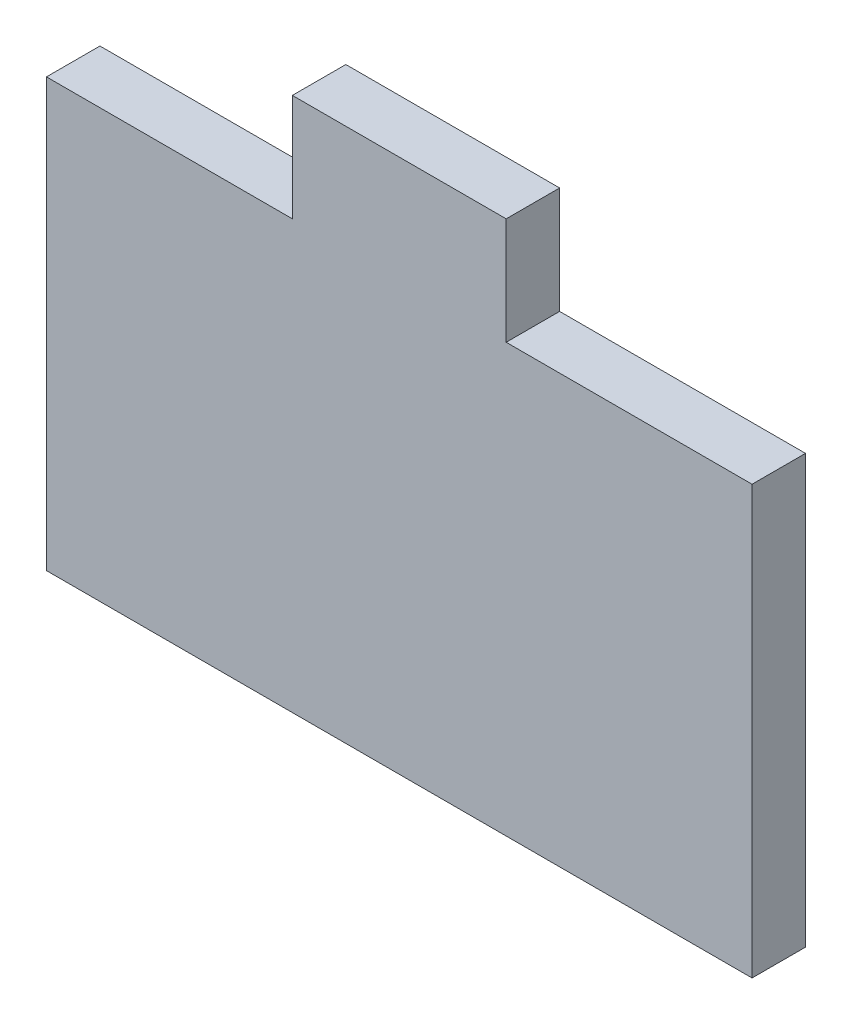
ISO-10303-21;
HEADER;
FILE_DESCRIPTION(('STEP AP214'),'2;1');
FILE_NAME('part.step','',(''),(''),'','','');
FILE_SCHEMA(('AUTOMOTIVE_DESIGN { 1 0 10303 214 1 1 1 1 }'));
ENDSEC;
DATA;
#1=APPLICATION_CONTEXT('core data for automotive mechanical design processes');
#2=APPLICATION_PROTOCOL_DEFINITION('international standard','automotive_design',2000,#1);
#3=PRODUCT_CONTEXT('',#1,'mechanical');
#4=PRODUCT('Part','Part','',(#3));
#5=PRODUCT_RELATED_PRODUCT_CATEGORY('part','',(#4));
#6=PRODUCT_DEFINITION_FORMATION('','',#4);
#7=PRODUCT_DEFINITION_CONTEXT('part definition',#1,'design');
#8=PRODUCT_DEFINITION('design','',#6,#7);
#9=PRODUCT_DEFINITION_SHAPE('','',#8);
#10=(LENGTH_UNIT() NAMED_UNIT(*) SI_UNIT(.MILLI.,.METRE.));
#11=(NAMED_UNIT(*) PLANE_ANGLE_UNIT() SI_UNIT($,.RADIAN.));
#12=(NAMED_UNIT(*) SI_UNIT($,.STERADIAN.) SOLID_ANGLE_UNIT());
#13=UNCERTAINTY_MEASURE_WITH_UNIT(LENGTH_MEASURE(1.E-05),#10,'distance_accuracy_value','');
#14=(GEOMETRIC_REPRESENTATION_CONTEXT(3) GLOBAL_UNCERTAINTY_ASSIGNED_CONTEXT((#13)) GLOBAL_UNIT_ASSIGNED_CONTEXT((#10,
#11,#12)) REPRESENTATION_CONTEXT('',''));
#15=CARTESIAN_POINT('',(0.,0.,0.));
#16=DIRECTION('',(0.,0.,1.));
#17=DIRECTION('',(1.,0.,0.));
#18=AXIS2_PLACEMENT_3D('',#15,#16,#17);
#19=CARTESIAN_POINT('',(0.,15.,2.5));
#20=DIRECTION('',(0.,-1.,0.));
#21=DIRECTION('',(1.,0.,0.));
#22=AXIS2_PLACEMENT_3D('',#19,#20,#21);
#23=PLANE('',#22);
#24=DIRECTION('',(-1.,0.,0.));
#25=VECTOR('',#24,1.);
#26=CARTESIAN_POINT('',(0.,15.,0.));
#27=LINE('',#26,#25);
#28=CARTESIAN_POINT('',(5.,15.,0.));
#29=VERTEX_POINT('',#28);
#30=CARTESIAN_POINT('',(-5.,15.,0.));
#31=VERTEX_POINT('',#30);
#32=EDGE_CURVE('E148',#29,#31,#27,.T.);
#33=ORIENTED_EDGE('',*,*,#32,.T.);
#34=DIRECTION('',(0.,0.,-1.));
#35=VECTOR('',#34,1.);
#36=CARTESIAN_POINT('',(-5.,15.,2.5));
#37=LINE('',#36,#35);
#38=CARTESIAN_POINT('',(-5.,15.,2.5));
#39=VERTEX_POINT('',#38);
#40=EDGE_CURVE('E11',#39,#31,#37,.T.);
#41=ORIENTED_EDGE('',*,*,#40,.F.);
#42=DIRECTION('',(-1.,0.,0.));
#43=VECTOR('',#42,1.);
#44=CARTESIAN_POINT('',(0.,15.,2.5));
#45=LINE('',#44,#43);
#46=CARTESIAN_POINT('',(5.,15.,2.5));
#47=VERTEX_POINT('',#46);
#48=EDGE_CURVE('E172',#47,#39,#45,.T.);
#49=ORIENTED_EDGE('',*,*,#48,.F.);
#50=DIRECTION('',(0.,0.,-1.));
#51=VECTOR('',#50,1.);
#52=CARTESIAN_POINT('',(5.,15.,2.5));
#53=LINE('',#52,#51);
#54=EDGE_CURVE('E60',#47,#29,#53,.T.);
#55=ORIENTED_EDGE('',*,*,#54,.T.);
#56=EDGE_LOOP('',(#33,#41,#49,#55));
#57=FACE_BOUND('',#56,.T.);
#58=ADVANCED_FACE('F43',(#57),#23,.F.);
#59=CARTESIAN_POINT('',(-4.99999999999999,0.,2.5));
#60=DIRECTION('',(1.,0.,0.));
#61=DIRECTION('',(0.,1.,0.));
#62=AXIS2_PLACEMENT_3D('',#59,#60,#61);
#63=PLANE('',#62);
#64=DIRECTION('',(0.,-1.,0.));
#65=VECTOR('',#64,1.);
#66=CARTESIAN_POINT('',(-4.99999999999999,0.,0.));
#67=LINE('',#66,#65);
#68=CARTESIAN_POINT('',(-5.,10.,0.));
#69=VERTEX_POINT('',#68);
#70=EDGE_CURVE('E151',#31,#69,#67,.T.);
#71=ORIENTED_EDGE('',*,*,#70,.T.);
#72=DIRECTION('',(0.,0.,-1.));
#73=VECTOR('',#72,1.);
#74=CARTESIAN_POINT('',(-5.,10.,2.5));
#75=LINE('',#74,#73);
#76=CARTESIAN_POINT('',(-5.,10.,2.5));
#77=VERTEX_POINT('',#76);
#78=EDGE_CURVE('E52',#77,#69,#75,.T.);
#79=ORIENTED_EDGE('',*,*,#78,.F.);
#80=DIRECTION('',(0.,-1.,0.));
#81=VECTOR('',#80,1.);
#82=CARTESIAN_POINT('',(-4.99999999999999,0.,2.5));
#83=LINE('',#82,#81);
#84=EDGE_CURVE('E99',#39,#77,#83,.T.);
#85=ORIENTED_EDGE('',*,*,#84,.F.);
#86=ORIENTED_EDGE('',*,*,#40,.T.);
#87=EDGE_LOOP('',(#71,#79,#85,#86));
#88=FACE_BOUND('',#87,.T.);
#89=ADVANCED_FACE('F207',(#88),#63,.F.);
#90=CARTESIAN_POINT('',(0.,10.,2.5));
#91=DIRECTION('',(0.,-1.,0.));
#92=DIRECTION('',(1.,0.,0.));
#93=AXIS2_PLACEMENT_3D('',#90,#91,#92);
#94=PLANE('',#93);
#95=DIRECTION('',(-1.,0.,0.));
#96=VECTOR('',#95,1.);
#97=CARTESIAN_POINT('',(0.,10.,0.));
#98=LINE('',#97,#96);
#99=CARTESIAN_POINT('',(-16.5,10.,0.));
#100=VERTEX_POINT('',#99);
#101=EDGE_CURVE('E154',#69,#100,#98,.T.);
#102=ORIENTED_EDGE('',*,*,#101,.T.);
#103=DIRECTION('',(0.,0.,-1.));
#104=VECTOR('',#103,1.);
#105=CARTESIAN_POINT('',(-16.5,10.,2.5));
#106=LINE('',#105,#104);
#107=CARTESIAN_POINT('',(-16.5,10.,2.5));
#108=VERTEX_POINT('',#107);
#109=EDGE_CURVE('E182',#108,#100,#106,.T.);
#110=ORIENTED_EDGE('',*,*,#109,.F.);
#111=DIRECTION('',(-1.,0.,0.));
#112=VECTOR('',#111,1.);
#113=CARTESIAN_POINT('',(0.,10.,2.5));
#114=LINE('',#113,#112);
#115=EDGE_CURVE('E134',#77,#108,#114,.T.);
#116=ORIENTED_EDGE('',*,*,#115,.F.);
#117=ORIENTED_EDGE('',*,*,#78,.T.);
#118=EDGE_LOOP('',(#102,#110,#116,#117));
#119=FACE_BOUND('',#118,.T.);
#120=ADVANCED_FACE('F190',(#119),#94,.F.);
#121=CARTESIAN_POINT('',(-16.5,0.,2.5));
#122=DIRECTION('',(1.,0.,0.));
#123=DIRECTION('',(0.,1.,0.));
#124=AXIS2_PLACEMENT_3D('',#121,#122,#123);
#125=PLANE('',#124);
#126=DIRECTION('',(0.,-1.,0.));
#127=VECTOR('',#126,1.);
#128=CARTESIAN_POINT('',(-16.5,0.,0.));
#129=LINE('',#128,#127);
#130=CARTESIAN_POINT('',(-16.5,-10.,0.));
#131=VERTEX_POINT('',#130);
#132=EDGE_CURVE('E157',#100,#131,#129,.T.);
#133=ORIENTED_EDGE('',*,*,#132,.T.);
#134=DIRECTION('',(0.,0.,-1.));
#135=VECTOR('',#134,1.);
#136=CARTESIAN_POINT('',(-16.5,-10.,2.5));
#137=LINE('',#136,#135);
#138=CARTESIAN_POINT('',(-16.5,-10.,2.5));
#139=VERTEX_POINT('',#138);
#140=EDGE_CURVE('E179',#139,#131,#137,.T.);
#141=ORIENTED_EDGE('',*,*,#140,.F.);
#142=DIRECTION('',(0.,-1.,0.));
#143=VECTOR('',#142,1.);
#144=CARTESIAN_POINT('',(-16.5,0.,2.5));
#145=LINE('',#144,#143);
#146=EDGE_CURVE('E142',#108,#139,#145,.T.);
#147=ORIENTED_EDGE('',*,*,#146,.F.);
#148=ORIENTED_EDGE('',*,*,#109,.T.);
#149=EDGE_LOOP('',(#133,#141,#147,#148));
#150=FACE_BOUND('',#149,.T.);
#151=ADVANCED_FACE('F198',(#150),#125,.F.);
#152=CARTESIAN_POINT('',(0.,-10.,2.5));
#153=DIRECTION('',(0.,-1.,0.));
#154=DIRECTION('',(1.,0.,0.));
#155=AXIS2_PLACEMENT_3D('',#152,#153,#154);
#156=PLANE('',#155);
#157=DIRECTION('',(-1.,0.,0.));
#158=VECTOR('',#157,1.);
#159=CARTESIAN_POINT('',(0.,-10.,0.));
#160=LINE('',#159,#158);
#161=CARTESIAN_POINT('',(16.5,-10.,0.));
#162=VERTEX_POINT('',#161);
#163=EDGE_CURVE('E162',#162,#131,#160,.T.);
#164=ORIENTED_EDGE('',*,*,#163,.F.);
#165=DIRECTION('',(0.,0.,-1.));
#166=VECTOR('',#165,1.);
#167=CARTESIAN_POINT('',(16.5,-10.,2.5));
#168=LINE('',#167,#166);
#169=CARTESIAN_POINT('',(16.5,-10.,2.5));
#170=VERTEX_POINT('',#169);
#171=EDGE_CURVE('E125',#170,#162,#168,.T.);
#172=ORIENTED_EDGE('',*,*,#171,.F.);
#173=DIRECTION('',(-1.,0.,0.));
#174=VECTOR('',#173,1.);
#175=CARTESIAN_POINT('',(0.,-10.,2.5));
#176=LINE('',#175,#174);
#177=EDGE_CURVE('E138',#170,#139,#176,.T.);
#178=ORIENTED_EDGE('',*,*,#177,.T.);
#179=ORIENTED_EDGE('',*,*,#140,.T.);
#180=EDGE_LOOP('',(#164,#172,#178,#179));
#181=FACE_BOUND('',#180,.T.);
#182=ADVANCED_FACE('F217',(#181),#156,.T.);
#183=CARTESIAN_POINT('',(16.5,0.,2.5));
#184=DIRECTION('',(1.,0.,0.));
#185=DIRECTION('',(0.,1.,0.));
#186=AXIS2_PLACEMENT_3D('',#183,#184,#185);
#187=PLANE('',#186);
#188=DIRECTION('',(0.,-1.,0.));
#189=VECTOR('',#188,1.);
#190=CARTESIAN_POINT('',(16.5,0.,0.));
#191=LINE('',#190,#189);
#192=CARTESIAN_POINT('',(16.5,10.,0.));
#193=VERTEX_POINT('',#192);
#194=EDGE_CURVE('E121',#193,#162,#191,.T.);
#195=ORIENTED_EDGE('',*,*,#194,.F.);
#196=DIRECTION('',(0.,0.,-1.));
#197=VECTOR('',#196,1.);
#198=CARTESIAN_POINT('',(16.5,10.,2.5));
#199=LINE('',#198,#197);
#200=CARTESIAN_POINT('',(16.5,10.,2.5));
#201=VERTEX_POINT('',#200);
#202=EDGE_CURVE('E115',#201,#193,#199,.T.);
#203=ORIENTED_EDGE('',*,*,#202,.F.);
#204=DIRECTION('',(0.,-1.,0.));
#205=VECTOR('',#204,1.);
#206=CARTESIAN_POINT('',(16.5,0.,2.5));
#207=LINE('',#206,#205);
#208=EDGE_CURVE('E119',#201,#170,#207,.T.);
#209=ORIENTED_EDGE('',*,*,#208,.T.);
#210=ORIENTED_EDGE('',*,*,#171,.T.);
#211=EDGE_LOOP('',(#195,#203,#209,#210));
#212=FACE_BOUND('',#211,.T.);
#213=ADVANCED_FACE('F117',(#212),#187,.T.);
#214=CARTESIAN_POINT('',(5.,10.,0.));
#215=VERTEX_POINT('',#214);
#216=EDGE_CURVE('E158',#193,#215,#98,.T.);
#217=ORIENTED_EDGE('',*,*,#216,.T.);
#218=DIRECTION('',(0.,0.,-1.));
#219=VECTOR('',#218,1.);
#220=CARTESIAN_POINT('',(5.,10.,2.5));
#221=LINE('',#220,#219);
#222=CARTESIAN_POINT('',(5.,10.,2.5));
#223=VERTEX_POINT('',#222);
#224=EDGE_CURVE('E87',#223,#215,#221,.T.);
#225=ORIENTED_EDGE('',*,*,#224,.F.);
#226=EDGE_CURVE('E127',#201,#223,#114,.T.);
#227=ORIENTED_EDGE('',*,*,#226,.F.);
#228=ORIENTED_EDGE('',*,*,#202,.T.);
#229=EDGE_LOOP('',(#217,#225,#227,#228));
#230=FACE_BOUND('',#229,.T.);
#231=ADVANCED_FACE('F128',(#230),#94,.F.);
#232=CARTESIAN_POINT('',(5.,0.,2.5));
#233=DIRECTION('',(1.,0.,0.));
#234=DIRECTION('',(0.,0.,-1.));
#235=AXIS2_PLACEMENT_3D('',#232,#233,#234);
#236=PLANE('',#235);
#237=DIRECTION('',(0.,-1.,0.));
#238=VECTOR('',#237,1.);
#239=CARTESIAN_POINT('',(5.,0.,0.));
#240=LINE('',#239,#238);
#241=EDGE_CURVE('E168',#29,#215,#240,.T.);
#242=ORIENTED_EDGE('',*,*,#241,.F.);
#243=ORIENTED_EDGE('',*,*,#54,.F.);
#244=DIRECTION('',(0.,-1.,0.));
#245=VECTOR('',#244,1.);
#246=CARTESIAN_POINT('',(5.,0.,2.5));
#247=LINE('',#246,#245);
#248=EDGE_CURVE('E132',#47,#223,#247,.T.);
#249=ORIENTED_EDGE('',*,*,#248,.T.);
#250=ORIENTED_EDGE('',*,*,#224,.T.);
#251=EDGE_LOOP('',(#242,#243,#249,#250));
#252=FACE_BOUND('',#251,.T.);
#253=ADVANCED_FACE('F224',(#252),#236,.T.);
#254=CARTESIAN_POINT('',(0.,0.,2.5));
#255=DIRECTION('',(0.,0.,1.));
#256=DIRECTION('',(1.,0.,0.));
#257=AXIS2_PLACEMENT_3D('',#254,#255,#256);
#258=PLANE('',#257);
#259=ORIENTED_EDGE('',*,*,#48,.T.);
#260=ORIENTED_EDGE('',*,*,#84,.T.);
#261=ORIENTED_EDGE('',*,*,#115,.T.);
#262=ORIENTED_EDGE('',*,*,#146,.T.);
#263=ORIENTED_EDGE('',*,*,#177,.F.);
#264=ORIENTED_EDGE('',*,*,#208,.F.);
#265=ORIENTED_EDGE('',*,*,#226,.T.);
#266=ORIENTED_EDGE('',*,*,#248,.F.);
#267=EDGE_LOOP('',(#259,#260,#261,#262,#263,#264,#265,#266));
#268=FACE_BOUND('',#267,.T.);
#269=ADVANCED_FACE('F136',(#268),#258,.T.);
#270=CARTESIAN_POINT('',(0.,0.,0.));
#271=DIRECTION('',(0.,0.,1.));
#272=DIRECTION('',(1.,0.,0.));
#273=AXIS2_PLACEMENT_3D('',#270,#271,#272);
#274=PLANE('',#273);
#275=ORIENTED_EDGE('',*,*,#32,.F.);
#276=ORIENTED_EDGE('',*,*,#241,.T.);
#277=ORIENTED_EDGE('',*,*,#216,.F.);
#278=ORIENTED_EDGE('',*,*,#194,.T.);
#279=ORIENTED_EDGE('',*,*,#163,.T.);
#280=ORIENTED_EDGE('',*,*,#132,.F.);
#281=ORIENTED_EDGE('',*,*,#101,.F.);
#282=ORIENTED_EDGE('',*,*,#70,.F.);
#283=EDGE_LOOP('',(#275,#276,#277,#278,#279,#280,#281,#282));
#284=FACE_BOUND('',#283,.T.);
#285=ADVANCED_FACE('F194',(#284),#274,.F.);
#286=CLOSED_SHELL('',(#58,#89,#120,#151,#182,#213,#231,#253,#269,#285));
#287=MANIFOLD_SOLID_BREP('B2',#286);
#288=ADVANCED_BREP_SHAPE_REPRESENTATION('',(#18,#287),#14);
#289=SHAPE_DEFINITION_REPRESENTATION(#9,#288);
ENDSEC;
END-ISO-10303-21;
